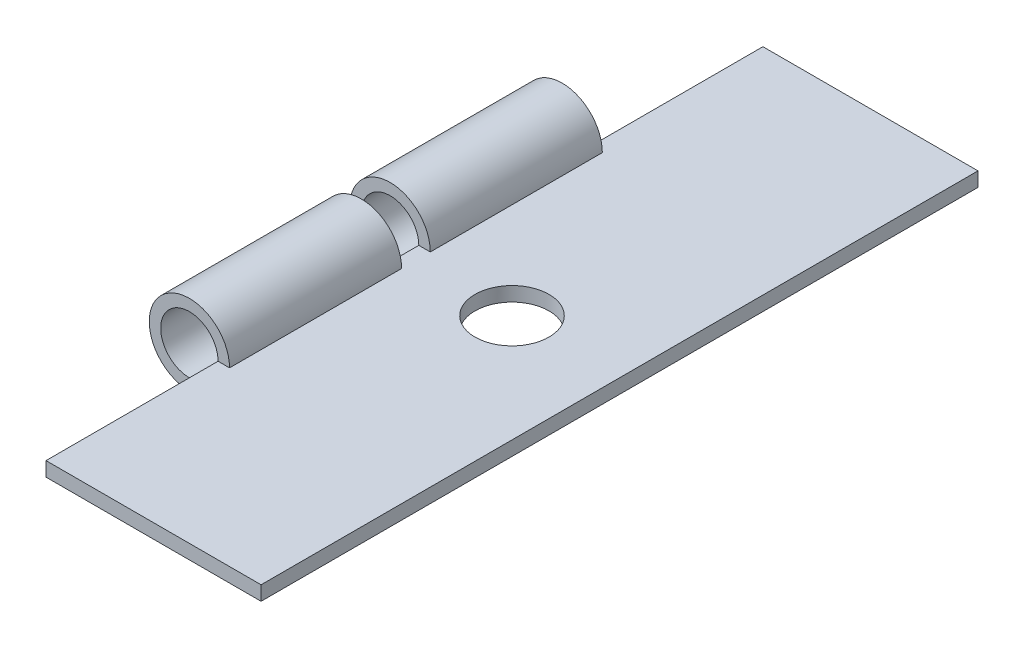
ISO-10303-21;
HEADER;
FILE_DESCRIPTION(('STEP AP214'),'2;1');
FILE_NAME('part.step','',(''),(''),'','','');
FILE_SCHEMA(('AUTOMOTIVE_DESIGN { 1 0 10303 214 1 1 1 1 }'));
ENDSEC;
DATA;
#1=APPLICATION_CONTEXT('core data for automotive mechanical design processes');
#2=APPLICATION_PROTOCOL_DEFINITION('international standard','automotive_design',2000,#1);
#3=PRODUCT_CONTEXT('',#1,'mechanical');
#4=PRODUCT('Part','Part','',(#3));
#5=PRODUCT_RELATED_PRODUCT_CATEGORY('part','',(#4));
#6=PRODUCT_DEFINITION_FORMATION('','',#4);
#7=PRODUCT_DEFINITION_CONTEXT('part definition',#1,'design');
#8=PRODUCT_DEFINITION('design','',#6,#7);
#9=PRODUCT_DEFINITION_SHAPE('','',#8);
#10=(LENGTH_UNIT() NAMED_UNIT(*) SI_UNIT(.MILLI.,.METRE.));
#11=(NAMED_UNIT(*) PLANE_ANGLE_UNIT() SI_UNIT($,.RADIAN.));
#12=(NAMED_UNIT(*) SI_UNIT($,.STERADIAN.) SOLID_ANGLE_UNIT());
#13=UNCERTAINTY_MEASURE_WITH_UNIT(LENGTH_MEASURE(1.E-05),#10,'distance_accuracy_value','');
#14=(GEOMETRIC_REPRESENTATION_CONTEXT(3) GLOBAL_UNCERTAINTY_ASSIGNED_CONTEXT((#13)) GLOBAL_UNIT_ASSIGNED_CONTEXT((#10,
#11,#12)) REPRESENTATION_CONTEXT('',''));
#15=CARTESIAN_POINT('',(0.,0.,0.));
#16=DIRECTION('',(0.,0.,1.));
#17=DIRECTION('',(1.,0.,0.));
#18=AXIS2_PLACEMENT_3D('',#15,#16,#17);
#19=CARTESIAN_POINT('',(-4.7625,0.3175,15.875));
#20=DIRECTION('',(1.,0.,0.));
#21=DIRECTION('',(0.,0.,-1.));
#22=AXIS2_PLACEMENT_3D('',#19,#20,#21);
#23=PLANE('',#22);
#24=DIRECTION('',(0.,-1.,0.));
#25=VECTOR('',#24,1.);
#26=CARTESIAN_POINT('',(-4.7625,0.3175,0.635000000000004));
#27=LINE('',#26,#25);
#28=CARTESIAN_POINT('',(-4.7625,0.3175,0.635000000000004));
#29=VERTEX_POINT('',#28);
#30=CARTESIAN_POINT('',(-4.7625,-0.3175,0.635000000000004));
#31=VERTEX_POINT('',#30);
#32=EDGE_CURVE('E154',#29,#31,#27,.T.);
#33=ORIENTED_EDGE('',*,*,#32,.F.);
#34=DIRECTION('',(0.,0.,1.));
#35=VECTOR('',#34,1.);
#36=CARTESIAN_POINT('',(-4.7625,0.3175,15.875));
#37=LINE('',#36,#35);
#38=CARTESIAN_POINT('',(-4.7625,0.3175,-0.635000000000004));
#39=VERTEX_POINT('',#38);
#40=EDGE_CURVE('E205',#39,#29,#37,.T.);
#41=ORIENTED_EDGE('',*,*,#40,.F.);
#42=DIRECTION('',(0.,1.,0.));
#43=VECTOR('',#42,1.);
#44=CARTESIAN_POINT('',(-4.7625,0.3175,-0.635000000000004));
#45=LINE('',#44,#43);
#46=CARTESIAN_POINT('',(-4.7625,-0.3175,-0.635000000000004));
#47=VERTEX_POINT('',#46);
#48=EDGE_CURVE('E184',#47,#39,#45,.T.);
#49=ORIENTED_EDGE('',*,*,#48,.F.);
#50=DIRECTION('',(0.,0.,1.));
#51=VECTOR('',#50,1.);
#52=CARTESIAN_POINT('',(-4.7625,-0.3175,15.875));
#53=LINE('',#52,#51);
#54=EDGE_CURVE('E220',#47,#31,#53,.T.);
#55=ORIENTED_EDGE('',*,*,#54,.T.);
#56=EDGE_LOOP('',(#33,#41,#49,#55));
#57=FACE_BOUND('',#56,.T.);
#58=ADVANCED_FACE('F39',(#57),#23,.F.);
#59=DIRECTION('',(0.,1.,0.));
#60=VECTOR('',#59,1.);
#61=CARTESIAN_POINT('',(-4.7625,0.3175,8.255));
#62=LINE('',#61,#60);
#63=CARTESIAN_POINT('',(-4.7625,-0.3175,8.255));
#64=VERTEX_POINT('',#63);
#65=CARTESIAN_POINT('',(-4.7625,0.3175,8.255));
#66=VERTEX_POINT('',#65);
#67=EDGE_CURVE('E130',#64,#66,#62,.T.);
#68=ORIENTED_EDGE('',*,*,#67,.F.);
#69=CARTESIAN_POINT('',(-4.7625,-0.3175,15.875));
#70=VERTEX_POINT('',#69);
#71=EDGE_CURVE('E215',#64,#70,#53,.T.);
#72=ORIENTED_EDGE('',*,*,#71,.T.);
#73=DIRECTION('',(0.,-1.,0.));
#74=VECTOR('',#73,1.);
#75=CARTESIAN_POINT('',(-4.7625,0.3175,15.875));
#76=LINE('',#75,#74);
#77=CARTESIAN_POINT('',(-4.7625,0.3175,15.875));
#78=VERTEX_POINT('',#77);
#79=EDGE_CURVE('E226',#78,#70,#76,.T.);
#80=ORIENTED_EDGE('',*,*,#79,.F.);
#81=EDGE_CURVE('E199',#66,#78,#37,.T.);
#82=ORIENTED_EDGE('',*,*,#81,.F.);
#83=EDGE_LOOP('',(#68,#72,#80,#82));
#84=FACE_BOUND('',#83,.T.);
#85=ADVANCED_FACE('F291',(#84),#23,.F.);
#86=CARTESIAN_POINT('',(0.,0.3175,0.));
#87=DIRECTION('',(0.,-1.,0.));
#88=DIRECTION('',(0.,0.,-1.));
#89=AXIS2_PLACEMENT_3D('',#86,#87,#88);
#90=PLANE('',#89);
#91=CARTESIAN_POINT('',(0.,0.3175,0.));
#92=DIRECTION('',(0.,1.,0.));
#93=DIRECTION('',(0.,0.,1.));
#94=AXIS2_PLACEMENT_3D('',#91,#92,#93);
#95=CIRCLE('',#94,1.6383);
#96=CARTESIAN_POINT('',(0.,0.3175,1.6383));
#97=VERTEX_POINT('',#96);
#98=EDGE_CURVE('E270',#97,#97,#95,.T.);
#99=ORIENTED_EDGE('',*,*,#98,.F.);
#100=EDGE_LOOP('',(#99));
#101=FACE_BOUND('',#100,.T.);
#102=DIRECTION('',(-1.,0.,0.));
#103=VECTOR('',#102,1.);
#104=CARTESIAN_POINT('',(0.,0.3175,0.635000000000004));
#105=LINE('',#104,#103);
#106=CARTESIAN_POINT('',(-4.2545,0.3175,0.635000000000004));
#107=VERTEX_POINT('',#106);
#108=EDGE_CURVE('E157',#107,#29,#105,.T.);
#109=ORIENTED_EDGE('',*,*,#108,.F.);
#110=DIRECTION('',(0.,0.,1.));
#111=VECTOR('',#110,1.);
#112=CARTESIAN_POINT('',(-4.2545,0.3175,15.875));
#113=LINE('',#112,#111);
#114=CARTESIAN_POINT('',(-4.2545,0.3175,8.255));
#115=VERTEX_POINT('',#114);
#116=EDGE_CURVE('E145',#115,#107,#113,.F.);
#117=ORIENTED_EDGE('',*,*,#116,.F.);
#118=DIRECTION('',(1.,0.,0.));
#119=VECTOR('',#118,1.);
#120=CARTESIAN_POINT('',(0.,0.3175,8.255));
#121=LINE('',#120,#119);
#122=EDGE_CURVE('E140',#66,#115,#121,.T.);
#123=ORIENTED_EDGE('',*,*,#122,.F.);
#124=ORIENTED_EDGE('',*,*,#81,.T.);
#125=DIRECTION('',(1.,0.,0.));
#126=VECTOR('',#125,1.);
#127=CARTESIAN_POINT('',(-4.7625,0.3175,15.875));
#128=LINE('',#127,#126);
#129=CARTESIAN_POINT('',(4.7625,0.3175,15.875));
#130=VERTEX_POINT('',#129);
#131=EDGE_CURVE('E204',#78,#130,#128,.T.);
#132=ORIENTED_EDGE('',*,*,#131,.T.);
#133=DIRECTION('',(0.,0.,-1.));
#134=VECTOR('',#133,1.);
#135=CARTESIAN_POINT('',(4.7625,0.3175,15.875));
#136=LINE('',#135,#134);
#137=CARTESIAN_POINT('',(4.7625,0.3175,-15.875));
#138=VERTEX_POINT('',#137);
#139=EDGE_CURVE('E191',#130,#138,#136,.T.);
#140=ORIENTED_EDGE('',*,*,#139,.T.);
#141=DIRECTION('',(-1.,0.,0.));
#142=VECTOR('',#141,1.);
#143=CARTESIAN_POINT('',(-4.7625,0.3175,-15.875));
#144=LINE('',#143,#142);
#145=CARTESIAN_POINT('',(-4.7625,0.3175,-15.875));
#146=VERTEX_POINT('',#145);
#147=EDGE_CURVE('E195',#138,#146,#144,.T.);
#148=ORIENTED_EDGE('',*,*,#147,.T.);
#149=CARTESIAN_POINT('',(-4.7625,0.3175,-8.255));
#150=VERTEX_POINT('',#149);
#151=EDGE_CURVE('E200',#146,#150,#37,.T.);
#152=ORIENTED_EDGE('',*,*,#151,.T.);
#153=DIRECTION('',(-1.,0.,0.));
#154=VECTOR('',#153,1.);
#155=CARTESIAN_POINT('',(0.,0.3175,-8.255));
#156=LINE('',#155,#154);
#157=CARTESIAN_POINT('',(-4.2545,0.3175,-8.255));
#158=VERTEX_POINT('',#157);
#159=EDGE_CURVE('E178',#158,#150,#156,.T.);
#160=ORIENTED_EDGE('',*,*,#159,.F.);
#161=DIRECTION('',(0.,0.,-1.));
#162=VECTOR('',#161,1.);
#163=CARTESIAN_POINT('',(-4.2545,0.3175,-15.875));
#164=LINE('',#163,#162);
#165=CARTESIAN_POINT('',(-4.2545,0.3175,-0.635000000000004));
#166=VERTEX_POINT('',#165);
#167=EDGE_CURVE('E181',#166,#158,#164,.T.);
#168=ORIENTED_EDGE('',*,*,#167,.F.);
#169=DIRECTION('',(1.,0.,0.));
#170=VECTOR('',#169,1.);
#171=CARTESIAN_POINT('',(0.,0.3175,-0.635000000000004));
#172=LINE('',#171,#170);
#173=EDGE_CURVE('E187',#39,#166,#172,.T.);
#174=ORIENTED_EDGE('',*,*,#173,.F.);
#175=ORIENTED_EDGE('',*,*,#40,.T.);
#176=EDGE_LOOP('',(#109,#117,#123,#124,#132,#140,#148,#152,#160,#168,#174,#175));
#177=FACE_BOUND('',#176,.T.);
#178=ADVANCED_FACE('F283',(#101,#177),#90,.F.);
#179=CARTESIAN_POINT('',(0.,-0.3175,0.));
#180=DIRECTION('',(0.,-1.,0.));
#181=DIRECTION('',(0.,0.,-1.));
#182=AXIS2_PLACEMENT_3D('',#179,#180,#181);
#183=PLANE('',#182);
#184=CARTESIAN_POINT('',(0.,-0.3175,0.));
#185=DIRECTION('',(0.,-1.,0.));
#186=DIRECTION('',(0.,0.,-1.));
#187=AXIS2_PLACEMENT_3D('',#184,#185,#186);
#188=CIRCLE('',#187,1.6383);
#189=CARTESIAN_POINT('',(0.,-0.3175,-1.6383));
#190=VERTEX_POINT('',#189);
#191=EDGE_CURVE('E43',#190,#190,#188,.T.);
#192=ORIENTED_EDGE('',*,*,#191,.F.);
#193=EDGE_LOOP('',(#192));
#194=FACE_BOUND('',#193,.T.);
#195=DIRECTION('',(0.,0.,1.));
#196=VECTOR('',#195,1.);
#197=CARTESIAN_POINT('',(-4.371759502511,-0.3175,15.875));
#198=LINE('',#197,#196);
#199=CARTESIAN_POINT('',(-4.371759502511,-0.3175,8.255));
#200=VERTEX_POINT('',#199);
#201=CARTESIAN_POINT('',(-4.371759502511,-0.3175,0.635000000000004));
#202=VERTEX_POINT('',#201);
#203=EDGE_CURVE('E49',#200,#202,#198,.F.);
#204=ORIENTED_EDGE('',*,*,#203,.T.);
#205=DIRECTION('',(-1.,0.,0.));
#206=VECTOR('',#205,1.);
#207=CARTESIAN_POINT('',(0.,-0.3175,0.635000000000004));
#208=LINE('',#207,#206);
#209=EDGE_CURVE('E11',#202,#31,#208,.T.);
#210=ORIENTED_EDGE('',*,*,#209,.T.);
#211=ORIENTED_EDGE('',*,*,#54,.F.);
#212=DIRECTION('',(1.,0.,0.));
#213=VECTOR('',#212,1.);
#214=CARTESIAN_POINT('',(0.,-0.3175,-0.635000000000004));
#215=LINE('',#214,#213);
#216=CARTESIAN_POINT('',(-4.371759502511,-0.3175,-0.635000000000004));
#217=VERTEX_POINT('',#216);
#218=EDGE_CURVE('E245',#47,#217,#215,.T.);
#219=ORIENTED_EDGE('',*,*,#218,.T.);
#220=DIRECTION('',(0.,0.,-1.));
#221=VECTOR('',#220,1.);
#222=CARTESIAN_POINT('',(-4.371759502511,-0.3175,-15.875));
#223=LINE('',#222,#221);
#224=CARTESIAN_POINT('',(-4.371759502511,-0.3175,-8.255));
#225=VERTEX_POINT('',#224);
#226=EDGE_CURVE('E241',#217,#225,#223,.T.);
#227=ORIENTED_EDGE('',*,*,#226,.T.);
#228=DIRECTION('',(-1.,0.,0.));
#229=VECTOR('',#228,1.);
#230=CARTESIAN_POINT('',(0.,-0.3175,-8.255));
#231=LINE('',#230,#229);
#232=CARTESIAN_POINT('',(-4.7625,-0.3175,-8.255));
#233=VERTEX_POINT('',#232);
#234=EDGE_CURVE('E238',#225,#233,#231,.T.);
#235=ORIENTED_EDGE('',*,*,#234,.T.);
#236=CARTESIAN_POINT('',(-4.7625,-0.3175,-15.875));
#237=VERTEX_POINT('',#236);
#238=EDGE_CURVE('E216',#237,#233,#53,.T.);
#239=ORIENTED_EDGE('',*,*,#238,.F.);
#240=DIRECTION('',(-1.,0.,0.));
#241=VECTOR('',#240,1.);
#242=CARTESIAN_POINT('',(-4.7625,-0.3175,-15.875));
#243=LINE('',#242,#241);
#244=CARTESIAN_POINT('',(4.7625,-0.3175,-15.875));
#245=VERTEX_POINT('',#244);
#246=EDGE_CURVE('E212',#245,#237,#243,.T.);
#247=ORIENTED_EDGE('',*,*,#246,.F.);
#248=DIRECTION('',(0.,0.,-1.));
#249=VECTOR('',#248,1.);
#250=CARTESIAN_POINT('',(4.7625,-0.3175,15.875));
#251=LINE('',#250,#249);
#252=CARTESIAN_POINT('',(4.7625,-0.3175,15.875));
#253=VERTEX_POINT('',#252);
#254=EDGE_CURVE('E190',#253,#245,#251,.T.);
#255=ORIENTED_EDGE('',*,*,#254,.F.);
#256=DIRECTION('',(1.,0.,0.));
#257=VECTOR('',#256,1.);
#258=CARTESIAN_POINT('',(-4.7625,-0.3175,15.875));
#259=LINE('',#258,#257);
#260=EDGE_CURVE('E196',#70,#253,#259,.T.);
#261=ORIENTED_EDGE('',*,*,#260,.F.);
#262=ORIENTED_EDGE('',*,*,#71,.F.);
#263=DIRECTION('',(1.,0.,0.));
#264=VECTOR('',#263,1.);
#265=CARTESIAN_POINT('',(0.,-0.3175,8.255));
#266=LINE('',#265,#264);
#267=EDGE_CURVE('E135',#64,#200,#266,.T.);
#268=ORIENTED_EDGE('',*,*,#267,.T.);
#269=EDGE_LOOP('',(#204,#210,#211,#219,#227,#235,#239,#247,#255,#261,#262,#268));
#270=FACE_BOUND('',#269,.T.);
#271=ADVANCED_FACE('F254',(#194,#270),#183,.T.);
#272=DIRECTION('',(0.,-1.,0.));
#273=VECTOR('',#272,1.);
#274=CARTESIAN_POINT('',(-4.7625,0.3175,-8.255));
#275=LINE('',#274,#273);
#276=EDGE_CURVE('E64',#150,#233,#275,.T.);
#277=ORIENTED_EDGE('',*,*,#276,.F.);
#278=ORIENTED_EDGE('',*,*,#151,.F.);
#279=DIRECTION('',(0.,-1.,0.));
#280=VECTOR('',#279,1.);
#281=CARTESIAN_POINT('',(-4.7625,0.3175,-15.875));
#282=LINE('',#281,#280);
#283=EDGE_CURVE('E230',#146,#237,#282,.T.);
#284=ORIENTED_EDGE('',*,*,#283,.T.);
#285=ORIENTED_EDGE('',*,*,#238,.T.);
#286=EDGE_LOOP('',(#277,#278,#284,#285));
#287=FACE_BOUND('',#286,.T.);
#288=ADVANCED_FACE('F282',(#287),#23,.F.);
#289=CARTESIAN_POINT('',(4.7625,0.3175,15.875));
#290=DIRECTION('',(-1.,0.,0.));
#291=DIRECTION('',(0.,0.,1.));
#292=AXIS2_PLACEMENT_3D('',#289,#290,#291);
#293=PLANE('',#292);
#294=ORIENTED_EDGE('',*,*,#254,.T.);
#295=DIRECTION('',(0.,-1.,0.));
#296=VECTOR('',#295,1.);
#297=CARTESIAN_POINT('',(4.7625,0.3175,-15.875));
#298=LINE('',#297,#296);
#299=EDGE_CURVE('E234',#138,#245,#298,.T.);
#300=ORIENTED_EDGE('',*,*,#299,.F.);
#301=ORIENTED_EDGE('',*,*,#139,.F.);
#302=DIRECTION('',(0.,-1.,0.));
#303=VECTOR('',#302,1.);
#304=CARTESIAN_POINT('',(4.7625,0.3175,15.875));
#305=LINE('',#304,#303);
#306=EDGE_CURVE('E208',#130,#253,#305,.T.);
#307=ORIENTED_EDGE('',*,*,#306,.T.);
#308=EDGE_LOOP('',(#294,#300,#301,#307));
#309=FACE_BOUND('',#308,.T.);
#310=ADVANCED_FACE('F41',(#309),#293,.F.);
#311=CARTESIAN_POINT('',(-4.7625,0.3175,-15.875));
#312=DIRECTION('',(0.,0.,1.));
#313=DIRECTION('',(1.,0.,0.));
#314=AXIS2_PLACEMENT_3D('',#311,#312,#313);
#315=PLANE('',#314);
#316=ORIENTED_EDGE('',*,*,#246,.T.);
#317=ORIENTED_EDGE('',*,*,#283,.F.);
#318=ORIENTED_EDGE('',*,*,#147,.F.);
#319=ORIENTED_EDGE('',*,*,#299,.T.);
#320=EDGE_LOOP('',(#316,#317,#318,#319));
#321=FACE_BOUND('',#320,.T.);
#322=ADVANCED_FACE('F302',(#321),#315,.F.);
#323=CARTESIAN_POINT('',(-4.7625,0.3175,15.875));
#324=DIRECTION('',(0.,0.,-1.));
#325=DIRECTION('',(-1.,0.,0.));
#326=AXIS2_PLACEMENT_3D('',#323,#324,#325);
#327=PLANE('',#326);
#328=ORIENTED_EDGE('',*,*,#260,.T.);
#329=ORIENTED_EDGE('',*,*,#306,.F.);
#330=ORIENTED_EDGE('',*,*,#131,.F.);
#331=ORIENTED_EDGE('',*,*,#79,.T.);
#332=EDGE_LOOP('',(#328,#329,#330,#331));
#333=FACE_BOUND('',#332,.T.);
#334=ADVANCED_FACE('F301',(#333),#327,.F.);
#335=CARTESIAN_POINT('',(-4.7625,0.3175,-0.635000000000004));
#336=DIRECTION('',(0.,0.,-1.));
#337=DIRECTION('',(-1.,0.,0.));
#338=AXIS2_PLACEMENT_3D('',#335,#336,#337);
#339=PLANE('',#338);
#340=CARTESIAN_POINT('',(-6.0325,0.3175,-0.635000000000004));
#341=DIRECTION('',(0.,0.,-1.));
#342=DIRECTION('',(-1.,0.,0.));
#343=AXIS2_PLACEMENT_3D('',#340,#341,#342);
#344=CIRCLE('',#343,1.27);
#345=EDGE_CURVE('E172',#39,#39,#344,.T.);
#346=ORIENTED_EDGE('',*,*,#345,.T.);
#347=ORIENTED_EDGE('',*,*,#173,.T.);
#348=CARTESIAN_POINT('',(-6.0325,0.3175,-0.635000000000004));
#349=DIRECTION('',(0.,0.,-1.));
#350=DIRECTION('',(-1.,0.,0.));
#351=AXIS2_PLACEMENT_3D('',#348,#349,#350);
#352=CIRCLE('',#351,1.778);
#353=EDGE_CURVE('E168',#217,#166,#352,.T.);
#354=ORIENTED_EDGE('',*,*,#353,.F.);
#355=ORIENTED_EDGE('',*,*,#218,.F.);
#356=ORIENTED_EDGE('',*,*,#48,.T.);
#357=EDGE_LOOP('',(#346,#347,#354,#355,#356));
#358=FACE_BOUND('',#357,.T.);
#359=ADVANCED_FACE('F309',(#358),#339,.F.);
#360=CARTESIAN_POINT('',(-6.0325,0.3175,-15.875));
#361=DIRECTION('',(0.,0.,-1.));
#362=DIRECTION('',(-1.,0.,0.));
#363=AXIS2_PLACEMENT_3D('',#360,#361,#362);
#364=CYLINDRICAL_SURFACE('',#363,1.778);
#365=ORIENTED_EDGE('',*,*,#353,.T.);
#366=ORIENTED_EDGE('',*,*,#167,.T.);
#367=CARTESIAN_POINT('',(-6.0325,0.3175,-8.255));
#368=DIRECTION('',(0.,0.,-1.));
#369=DIRECTION('',(-1.,0.,0.));
#370=AXIS2_PLACEMENT_3D('',#367,#368,#369);
#371=CIRCLE('',#370,1.778);
#372=EDGE_CURVE('E164',#225,#158,#371,.T.);
#373=ORIENTED_EDGE('',*,*,#372,.F.);
#374=ORIENTED_EDGE('',*,*,#226,.F.);
#375=EDGE_LOOP('',(#365,#366,#373,#374));
#376=FACE_BOUND('',#375,.T.);
#377=ADVANCED_FACE('F321',(#376),#364,.T.);
#378=CARTESIAN_POINT('',(-4.7625,0.3175,-8.255));
#379=DIRECTION('',(0.,0.,1.));
#380=DIRECTION('',(1.,0.,0.));
#381=AXIS2_PLACEMENT_3D('',#378,#379,#380);
#382=PLANE('',#381);
#383=ORIENTED_EDGE('',*,*,#372,.T.);
#384=ORIENTED_EDGE('',*,*,#159,.T.);
#385=CARTESIAN_POINT('',(-6.0325,0.3175,-8.255));
#386=DIRECTION('',(0.,0.,-1.));
#387=DIRECTION('',(-1.,0.,0.));
#388=AXIS2_PLACEMENT_3D('',#385,#386,#387);
#389=CIRCLE('',#388,1.27);
#390=EDGE_CURVE('E160',#150,#150,#389,.T.);
#391=ORIENTED_EDGE('',*,*,#390,.F.);
#392=ORIENTED_EDGE('',*,*,#276,.T.);
#393=ORIENTED_EDGE('',*,*,#234,.F.);
#394=EDGE_LOOP('',(#383,#384,#391,#392,#393));
#395=FACE_BOUND('',#394,.T.);
#396=ADVANCED_FACE('F318',(#395),#382,.F.);
#397=CARTESIAN_POINT('',(-6.0325,0.3175,-15.875));
#398=DIRECTION('',(0.,0.,-1.));
#399=DIRECTION('',(-1.,0.,0.));
#400=AXIS2_PLACEMENT_3D('',#397,#398,#399);
#401=CYLINDRICAL_SURFACE('',#400,1.27);
#402=ORIENTED_EDGE('',*,*,#345,.F.);
#403=EDGE_LOOP('',(#402));
#404=FACE_BOUND('',#403,.T.);
#405=ORIENTED_EDGE('',*,*,#390,.T.);
#406=EDGE_LOOP('',(#405));
#407=FACE_BOUND('',#406,.T.);
#408=ADVANCED_FACE('F329',(#404,#407),#401,.F.);
#409=CARTESIAN_POINT('',(-4.7625,0.3175,0.635000000000004));
#410=DIRECTION('',(0.,0.,1.));
#411=DIRECTION('',(-1.,0.,0.));
#412=AXIS2_PLACEMENT_3D('',#409,#410,#411);
#413=PLANE('',#412);
#414=CARTESIAN_POINT('',(-6.0325,0.3175,0.635000000000004));
#415=DIRECTION('',(0.,0.,-1.));
#416=DIRECTION('',(-1.,0.,0.));
#417=AXIS2_PLACEMENT_3D('',#414,#415,#416);
#418=CIRCLE('',#417,1.778);
#419=EDGE_CURVE('E148',#202,#107,#418,.T.);
#420=ORIENTED_EDGE('',*,*,#419,.T.);
#421=ORIENTED_EDGE('',*,*,#108,.T.);
#422=CARTESIAN_POINT('',(-6.0325,0.3175,0.635000000000004));
#423=DIRECTION('',(0.,0.,-1.));
#424=DIRECTION('',(-1.,0.,0.));
#425=AXIS2_PLACEMENT_3D('',#422,#423,#424);
#426=CIRCLE('',#425,1.27);
#427=EDGE_CURVE('E141',#29,#29,#426,.T.);
#428=ORIENTED_EDGE('',*,*,#427,.F.);
#429=ORIENTED_EDGE('',*,*,#32,.T.);
#430=ORIENTED_EDGE('',*,*,#209,.F.);
#431=EDGE_LOOP('',(#420,#421,#428,#429,#430));
#432=FACE_BOUND('',#431,.T.);
#433=ADVANCED_FACE('F331',(#432),#413,.F.);
#434=CARTESIAN_POINT('',(-6.0325,0.3175,15.875));
#435=DIRECTION('',(0.,0.,1.));
#436=DIRECTION('',(-1.,0.,0.));
#437=AXIS2_PLACEMENT_3D('',#434,#435,#436);
#438=CYLINDRICAL_SURFACE('',#437,1.778);
#439=CARTESIAN_POINT('',(-6.0325,0.3175,8.255));
#440=DIRECTION('',(0.,0.,-1.));
#441=DIRECTION('',(-1.,0.,0.));
#442=AXIS2_PLACEMENT_3D('',#439,#440,#441);
#443=CIRCLE('',#442,1.778);
#444=EDGE_CURVE('E56',#200,#115,#443,.T.);
#445=ORIENTED_EDGE('',*,*,#444,.T.);
#446=ORIENTED_EDGE('',*,*,#116,.T.);
#447=ORIENTED_EDGE('',*,*,#419,.F.);
#448=ORIENTED_EDGE('',*,*,#203,.F.);
#449=EDGE_LOOP('',(#445,#446,#447,#448));
#450=FACE_BOUND('',#449,.T.);
#451=ADVANCED_FACE('F259',(#450),#438,.T.);
#452=CARTESIAN_POINT('',(-4.7625,0.3175,8.255));
#453=DIRECTION('',(0.,0.,-1.));
#454=DIRECTION('',(1.,0.,0.));
#455=AXIS2_PLACEMENT_3D('',#452,#453,#454);
#456=PLANE('',#455);
#457=CARTESIAN_POINT('',(-6.0325,0.3175,8.255));
#458=DIRECTION('',(0.,0.,-1.));
#459=DIRECTION('',(-1.,0.,0.));
#460=AXIS2_PLACEMENT_3D('',#457,#458,#459);
#461=CIRCLE('',#460,1.27);
#462=EDGE_CURVE('E133',#66,#66,#461,.T.);
#463=ORIENTED_EDGE('',*,*,#462,.T.);
#464=ORIENTED_EDGE('',*,*,#122,.T.);
#465=ORIENTED_EDGE('',*,*,#444,.F.);
#466=ORIENTED_EDGE('',*,*,#267,.F.);
#467=ORIENTED_EDGE('',*,*,#67,.T.);
#468=EDGE_LOOP('',(#463,#464,#465,#466,#467));
#469=FACE_BOUND('',#468,.T.);
#470=ADVANCED_FACE('F131',(#469),#456,.F.);
#471=CARTESIAN_POINT('',(-6.0325,0.3175,15.875));
#472=DIRECTION('',(0.,0.,1.));
#473=DIRECTION('',(-1.,0.,0.));
#474=AXIS2_PLACEMENT_3D('',#471,#472,#473);
#475=CYLINDRICAL_SURFACE('',#474,1.27);
#476=ORIENTED_EDGE('',*,*,#462,.F.);
#477=EDGE_LOOP('',(#476));
#478=FACE_BOUND('',#477,.T.);
#479=ORIENTED_EDGE('',*,*,#427,.T.);
#480=EDGE_LOOP('',(#479));
#481=FACE_BOUND('',#480,.T.);
#482=ADVANCED_FACE('F347',(#478,#481),#475,.F.);
#483=CARTESIAN_POINT('',(0.,-12.3825,0.));
#484=DIRECTION('',(0.,1.,0.));
#485=DIRECTION('',(0.,0.,1.));
#486=AXIS2_PLACEMENT_3D('',#483,#484,#485);
#487=CYLINDRICAL_SURFACE('',#486,1.6383);
#488=ORIENTED_EDGE('',*,*,#191,.T.);
#489=EDGE_LOOP('',(#488));
#490=FACE_BOUND('',#489,.T.);
#491=ORIENTED_EDGE('',*,*,#98,.T.);
#492=EDGE_LOOP('',(#491));
#493=FACE_BOUND('',#492,.T.);
#494=ADVANCED_FACE('F279',(#490,#493),#487,.F.);
#495=CLOSED_SHELL('',(#58,#85,#178,#271,#288,#310,#322,#334,#359,#377,#396,#408,#433,#451,#470,
#482,#494));
#496=MANIFOLD_SOLID_BREP('B2',#495);
#497=ADVANCED_BREP_SHAPE_REPRESENTATION('',(#18,#496),#14);
#498=SHAPE_DEFINITION_REPRESENTATION(#9,#497);
ENDSEC;
END-ISO-10303-21;
